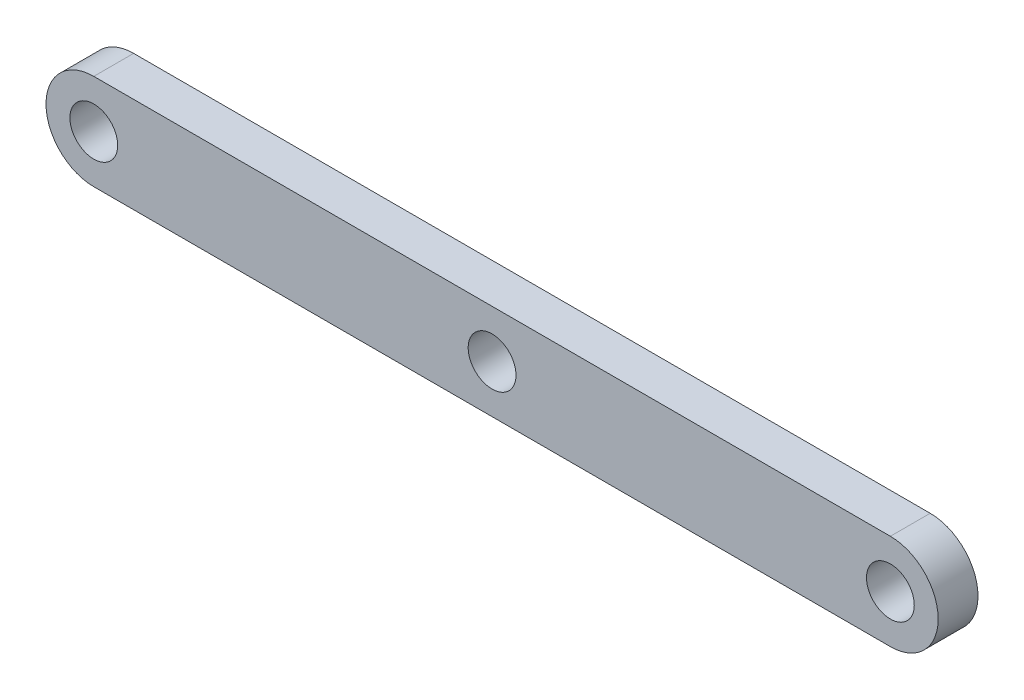
ISO-10303-21;
HEADER;
FILE_DESCRIPTION(('STEP AP214'),'2;1');
FILE_NAME('part.step','',(''),(''),'','','');
FILE_SCHEMA(('AUTOMOTIVE_DESIGN { 1 0 10303 214 1 1 1 1 }'));
ENDSEC;
DATA;
#1=APPLICATION_CONTEXT('core data for automotive mechanical design processes');
#2=APPLICATION_PROTOCOL_DEFINITION('international standard','automotive_design',2000,#1);
#3=PRODUCT_CONTEXT('',#1,'mechanical');
#4=PRODUCT('Part','Part','',(#3));
#5=PRODUCT_RELATED_PRODUCT_CATEGORY('part','',(#4));
#6=PRODUCT_DEFINITION_FORMATION('','',#4);
#7=PRODUCT_DEFINITION_CONTEXT('part definition',#1,'design');
#8=PRODUCT_DEFINITION('design','',#6,#7);
#9=PRODUCT_DEFINITION_SHAPE('','',#8);
#10=(LENGTH_UNIT() NAMED_UNIT(*) SI_UNIT(.MILLI.,.METRE.));
#11=(NAMED_UNIT(*) PLANE_ANGLE_UNIT() SI_UNIT($,.RADIAN.));
#12=(NAMED_UNIT(*) SI_UNIT($,.STERADIAN.) SOLID_ANGLE_UNIT());
#13=UNCERTAINTY_MEASURE_WITH_UNIT(LENGTH_MEASURE(1.E-05),#10,'distance_accuracy_value','');
#14=(GEOMETRIC_REPRESENTATION_CONTEXT(3) GLOBAL_UNCERTAINTY_ASSIGNED_CONTEXT((#13)) GLOBAL_UNIT_ASSIGNED_CONTEXT((#10,
#11,#12)) REPRESENTATION_CONTEXT('',''));
#15=CARTESIAN_POINT('',(0.,0.,0.));
#16=DIRECTION('',(0.,0.,1.));
#17=DIRECTION('',(1.,0.,0.));
#18=AXIS2_PLACEMENT_3D('',#15,#16,#17);
#19=CARTESIAN_POINT('',(-50.,0.,2.5));
#20=DIRECTION('',(0.,0.,1.));
#21=DIRECTION('',(1.,0.,0.));
#22=AXIS2_PLACEMENT_3D('',#19,#20,#21);
#23=PLANE('',#22);
#24=CARTESIAN_POINT('',(50.,0.,2.5));
#25=DIRECTION('',(0.,0.,1.));
#26=DIRECTION('',(1.,0.,0.));
#27=AXIS2_PLACEMENT_3D('',#24,#25,#26);
#28=CIRCLE('',#27,3.);
#29=CARTESIAN_POINT('',(53.,0.,2.5));
#30=VERTEX_POINT('',#29);
#31=EDGE_CURVE('E117',#30,#30,#28,.T.);
#32=ORIENTED_EDGE('',*,*,#31,.F.);
#33=EDGE_LOOP('',(#32));
#34=FACE_BOUND('',#33,.T.);
#35=CARTESIAN_POINT('',(-50.,0.,2.5));
#36=DIRECTION('',(0.,0.,1.));
#37=DIRECTION('',(1.,0.,0.));
#38=AXIS2_PLACEMENT_3D('',#35,#36,#37);
#39=CIRCLE('',#38,6.);
#40=CARTESIAN_POINT('',(-50.,6.00000000000001,2.5));
#41=VERTEX_POINT('',#40);
#42=CARTESIAN_POINT('',(-50.,-5.99999999999999,2.5));
#43=VERTEX_POINT('',#42);
#44=EDGE_CURVE('E87',#41,#43,#39,.T.);
#45=ORIENTED_EDGE('',*,*,#44,.T.);
#46=DIRECTION('',(1.,0.,0.));
#47=VECTOR('',#46,1.);
#48=CARTESIAN_POINT('',(-50.,-5.99999999999999,2.5));
#49=LINE('',#48,#47);
#50=CARTESIAN_POINT('',(50.,-6.,2.5));
#51=VERTEX_POINT('',#50);
#52=EDGE_CURVE('E82',#43,#51,#49,.T.);
#53=ORIENTED_EDGE('',*,*,#52,.T.);
#54=CARTESIAN_POINT('',(50.,0.,2.5));
#55=DIRECTION('',(0.,0.,1.));
#56=DIRECTION('',(1.,0.,0.));
#57=AXIS2_PLACEMENT_3D('',#54,#55,#56);
#58=CIRCLE('',#57,6.);
#59=CARTESIAN_POINT('',(50.,6.00000000000001,2.5));
#60=VERTEX_POINT('',#59);
#61=EDGE_CURVE('E85',#51,#60,#58,.T.);
#62=ORIENTED_EDGE('',*,*,#61,.T.);
#63=DIRECTION('',(-1.,0.,0.));
#64=VECTOR('',#63,1.);
#65=CARTESIAN_POINT('',(-50.,6.00000000000001,2.5));
#66=LINE('',#65,#64);
#67=EDGE_CURVE('E52',#60,#41,#66,.T.);
#68=ORIENTED_EDGE('',*,*,#67,.T.);
#69=EDGE_LOOP('',(#45,#53,#62,#68));
#70=FACE_BOUND('',#69,.T.);
#71=CARTESIAN_POINT('',(-50.,0.,2.5));
#72=DIRECTION('',(0.,0.,1.));
#73=DIRECTION('',(1.,0.,0.));
#74=AXIS2_PLACEMENT_3D('',#71,#72,#73);
#75=CIRCLE('',#74,3.);
#76=CARTESIAN_POINT('',(-47.,0.,2.5));
#77=VERTEX_POINT('',#76);
#78=EDGE_CURVE('E102',#77,#77,#75,.T.);
#79=ORIENTED_EDGE('',*,*,#78,.F.);
#80=EDGE_LOOP('',(#79));
#81=FACE_BOUND('',#80,.T.);
#82=CARTESIAN_POINT('',(0.,0.,2.5));
#83=DIRECTION('',(0.,0.,1.));
#84=DIRECTION('',(1.,0.,0.));
#85=AXIS2_PLACEMENT_3D('',#82,#83,#84);
#86=CIRCLE('',#85,3.);
#87=CARTESIAN_POINT('',(3.,0.,2.5));
#88=VERTEX_POINT('',#87);
#89=EDGE_CURVE('E123',#88,#88,#86,.T.);
#90=ORIENTED_EDGE('',*,*,#89,.F.);
#91=EDGE_LOOP('',(#90));
#92=FACE_BOUND('',#91,.T.);
#93=ADVANCED_FACE('F35',(#34,#70,#81,#92),#23,.T.);
#94=CARTESIAN_POINT('',(-50.,0.,-2.5));
#95=DIRECTION('',(0.,0.,1.));
#96=DIRECTION('',(1.,0.,0.));
#97=AXIS2_PLACEMENT_3D('',#94,#95,#96);
#98=PLANE('',#97);
#99=CARTESIAN_POINT('',(50.,0.,-2.5));
#100=DIRECTION('',(0.,0.,1.));
#101=DIRECTION('',(1.,0.,0.));
#102=AXIS2_PLACEMENT_3D('',#99,#100,#101);
#103=CIRCLE('',#102,3.);
#104=CARTESIAN_POINT('',(53.,0.,-2.5));
#105=VERTEX_POINT('',#104);
#106=EDGE_CURVE('E120',#105,#105,#103,.T.);
#107=ORIENTED_EDGE('',*,*,#106,.T.);
#108=EDGE_LOOP('',(#107));
#109=FACE_BOUND('',#108,.T.);
#110=CARTESIAN_POINT('',(-50.,0.,-2.5));
#111=DIRECTION('',(0.,0.,1.));
#112=DIRECTION('',(1.,0.,0.));
#113=AXIS2_PLACEMENT_3D('',#110,#111,#112);
#114=CIRCLE('',#113,6.);
#115=CARTESIAN_POINT('',(-50.,6.00000000000001,-2.5));
#116=VERTEX_POINT('',#115);
#117=CARTESIAN_POINT('',(-50.,-5.99999999999999,-2.5));
#118=VERTEX_POINT('',#117);
#119=EDGE_CURVE('E99',#116,#118,#114,.T.);
#120=ORIENTED_EDGE('',*,*,#119,.F.);
#121=DIRECTION('',(-1.,0.,0.));
#122=VECTOR('',#121,1.);
#123=CARTESIAN_POINT('',(-50.,6.00000000000001,-2.5));
#124=LINE('',#123,#122);
#125=CARTESIAN_POINT('',(50.,6.00000000000001,-2.5));
#126=VERTEX_POINT('',#125);
#127=EDGE_CURVE('E75',#126,#116,#124,.T.);
#128=ORIENTED_EDGE('',*,*,#127,.F.);
#129=CARTESIAN_POINT('',(50.,0.,-2.5));
#130=DIRECTION('',(0.,0.,1.));
#131=DIRECTION('',(1.,0.,0.));
#132=AXIS2_PLACEMENT_3D('',#129,#130,#131);
#133=CIRCLE('',#132,6.);
#134=CARTESIAN_POINT('',(50.,-6.,-2.5));
#135=VERTEX_POINT('',#134);
#136=EDGE_CURVE('E69',#135,#126,#133,.T.);
#137=ORIENTED_EDGE('',*,*,#136,.F.);
#138=DIRECTION('',(1.,0.,0.));
#139=VECTOR('',#138,1.);
#140=CARTESIAN_POINT('',(-50.,-5.99999999999999,-2.5));
#141=LINE('',#140,#139);
#142=EDGE_CURVE('E91',#118,#135,#141,.T.);
#143=ORIENTED_EDGE('',*,*,#142,.F.);
#144=EDGE_LOOP('',(#120,#128,#137,#143));
#145=FACE_BOUND('',#144,.T.);
#146=CARTESIAN_POINT('',(-50.,0.,-2.5));
#147=DIRECTION('',(0.,0.,1.));
#148=DIRECTION('',(1.,0.,0.));
#149=AXIS2_PLACEMENT_3D('',#146,#147,#148);
#150=CIRCLE('',#149,3.);
#151=CARTESIAN_POINT('',(-47.,0.,-2.5));
#152=VERTEX_POINT('',#151);
#153=EDGE_CURVE('E114',#152,#152,#150,.T.);
#154=ORIENTED_EDGE('',*,*,#153,.T.);
#155=EDGE_LOOP('',(#154));
#156=FACE_BOUND('',#155,.T.);
#157=CARTESIAN_POINT('',(0.,0.,-2.5));
#158=DIRECTION('',(0.,0.,1.));
#159=DIRECTION('',(1.,0.,0.));
#160=AXIS2_PLACEMENT_3D('',#157,#158,#159);
#161=CIRCLE('',#160,3.);
#162=CARTESIAN_POINT('',(3.,0.,-2.5));
#163=VERTEX_POINT('',#162);
#164=EDGE_CURVE('E126',#163,#163,#161,.T.);
#165=ORIENTED_EDGE('',*,*,#164,.T.);
#166=EDGE_LOOP('',(#165));
#167=FACE_BOUND('',#166,.T.);
#168=ADVANCED_FACE('F110',(#109,#145,#156,#167),#98,.F.);
#169=CARTESIAN_POINT('',(-50.,0.,2.5));
#170=DIRECTION('',(0.,0.,-1.));
#171=DIRECTION('',(-1.,0.,0.));
#172=AXIS2_PLACEMENT_3D('',#169,#170,#171);
#173=CYLINDRICAL_SURFACE('',#172,6.);
#174=ORIENTED_EDGE('',*,*,#119,.T.);
#175=DIRECTION('',(0.,0.,-1.));
#176=VECTOR('',#175,1.);
#177=CARTESIAN_POINT('',(-50.,-5.99999999999999,2.5));
#178=LINE('',#177,#176);
#179=EDGE_CURVE('E11',#43,#118,#178,.T.);
#180=ORIENTED_EDGE('',*,*,#179,.F.);
#181=ORIENTED_EDGE('',*,*,#44,.F.);
#182=DIRECTION('',(0.,0.,-1.));
#183=VECTOR('',#182,1.);
#184=CARTESIAN_POINT('',(-50.,6.00000000000001,2.5));
#185=LINE('',#184,#183);
#186=EDGE_CURVE('E95',#41,#116,#185,.T.);
#187=ORIENTED_EDGE('',*,*,#186,.T.);
#188=EDGE_LOOP('',(#174,#180,#181,#187));
#189=FACE_BOUND('',#188,.T.);
#190=ADVANCED_FACE('F37',(#189),#173,.T.);
#191=CARTESIAN_POINT('',(-50.,-5.99999999999999,2.5));
#192=DIRECTION('',(0.,1.,0.));
#193=DIRECTION('',(0.,0.,1.));
#194=AXIS2_PLACEMENT_3D('',#191,#192,#193);
#195=PLANE('',#194);
#196=ORIENTED_EDGE('',*,*,#142,.T.);
#197=DIRECTION('',(0.,0.,-1.));
#198=VECTOR('',#197,1.);
#199=CARTESIAN_POINT('',(50.,-6.,2.5));
#200=LINE('',#199,#198);
#201=EDGE_CURVE('E44',#51,#135,#200,.T.);
#202=ORIENTED_EDGE('',*,*,#201,.F.);
#203=ORIENTED_EDGE('',*,*,#52,.F.);
#204=ORIENTED_EDGE('',*,*,#179,.T.);
#205=EDGE_LOOP('',(#196,#202,#203,#204));
#206=FACE_BOUND('',#205,.T.);
#207=ADVANCED_FACE('F90',(#206),#195,.F.);
#208=CARTESIAN_POINT('',(50.,0.,2.5));
#209=DIRECTION('',(0.,0.,-1.));
#210=DIRECTION('',(-1.,0.,0.));
#211=AXIS2_PLACEMENT_3D('',#208,#209,#210);
#212=CYLINDRICAL_SURFACE('',#211,6.);
#213=ORIENTED_EDGE('',*,*,#136,.T.);
#214=DIRECTION('',(0.,0.,-1.));
#215=VECTOR('',#214,1.);
#216=CARTESIAN_POINT('',(50.,6.00000000000001,2.5));
#217=LINE('',#216,#215);
#218=EDGE_CURVE('E92',#60,#126,#217,.T.);
#219=ORIENTED_EDGE('',*,*,#218,.F.);
#220=ORIENTED_EDGE('',*,*,#61,.F.);
#221=ORIENTED_EDGE('',*,*,#201,.T.);
#222=EDGE_LOOP('',(#213,#219,#220,#221));
#223=FACE_BOUND('',#222,.T.);
#224=ADVANCED_FACE('F93',(#223),#212,.T.);
#225=CARTESIAN_POINT('',(-50.,6.00000000000001,2.5));
#226=DIRECTION('',(0.,-1.,0.));
#227=DIRECTION('',(1.,0.,0.));
#228=AXIS2_PLACEMENT_3D('',#225,#226,#227);
#229=PLANE('',#228);
#230=ORIENTED_EDGE('',*,*,#127,.T.);
#231=ORIENTED_EDGE('',*,*,#186,.F.);
#232=ORIENTED_EDGE('',*,*,#67,.F.);
#233=ORIENTED_EDGE('',*,*,#218,.T.);
#234=EDGE_LOOP('',(#230,#231,#232,#233));
#235=FACE_BOUND('',#234,.T.);
#236=ADVANCED_FACE('F107',(#235),#229,.F.);
#237=CARTESIAN_POINT('',(-50.,0.,2.5));
#238=DIRECTION('',(0.,0.,-1.));
#239=DIRECTION('',(-1.,0.,0.));
#240=AXIS2_PLACEMENT_3D('',#237,#238,#239);
#241=CYLINDRICAL_SURFACE('',#240,3.);
#242=ORIENTED_EDGE('',*,*,#78,.T.);
#243=EDGE_LOOP('',(#242));
#244=FACE_BOUND('',#243,.T.);
#245=ORIENTED_EDGE('',*,*,#153,.F.);
#246=EDGE_LOOP('',(#245));
#247=FACE_BOUND('',#246,.T.);
#248=ADVANCED_FACE('F145',(#244,#247),#241,.F.);
#249=CARTESIAN_POINT('',(50.,0.,2.5));
#250=DIRECTION('',(0.,0.,-1.));
#251=DIRECTION('',(-1.,0.,0.));
#252=AXIS2_PLACEMENT_3D('',#249,#250,#251);
#253=CYLINDRICAL_SURFACE('',#252,3.);
#254=ORIENTED_EDGE('',*,*,#31,.T.);
#255=EDGE_LOOP('',(#254));
#256=FACE_BOUND('',#255,.T.);
#257=ORIENTED_EDGE('',*,*,#106,.F.);
#258=EDGE_LOOP('',(#257));
#259=FACE_BOUND('',#258,.T.);
#260=ADVANCED_FACE('F191',(#256,#259),#253,.F.);
#261=CARTESIAN_POINT('',(0.,0.,2.5));
#262=DIRECTION('',(0.,0.,-1.));
#263=DIRECTION('',(-1.,0.,0.));
#264=AXIS2_PLACEMENT_3D('',#261,#262,#263);
#265=CYLINDRICAL_SURFACE('',#264,3.);
#266=ORIENTED_EDGE('',*,*,#89,.T.);
#267=EDGE_LOOP('',(#266));
#268=FACE_BOUND('',#267,.T.);
#269=ORIENTED_EDGE('',*,*,#164,.F.);
#270=EDGE_LOOP('',(#269));
#271=FACE_BOUND('',#270,.T.);
#272=ADVANCED_FACE('F132',(#268,#271),#265,.F.);
#273=CLOSED_SHELL('',(#93,#168,#190,#207,#224,#236,#248,#260,#272));
#274=MANIFOLD_SOLID_BREP('B2',#273);
#275=ADVANCED_BREP_SHAPE_REPRESENTATION('',(#18,#274),#14);
#276=SHAPE_DEFINITION_REPRESENTATION(#9,#275);
ENDSEC;
END-ISO-10303-21;
